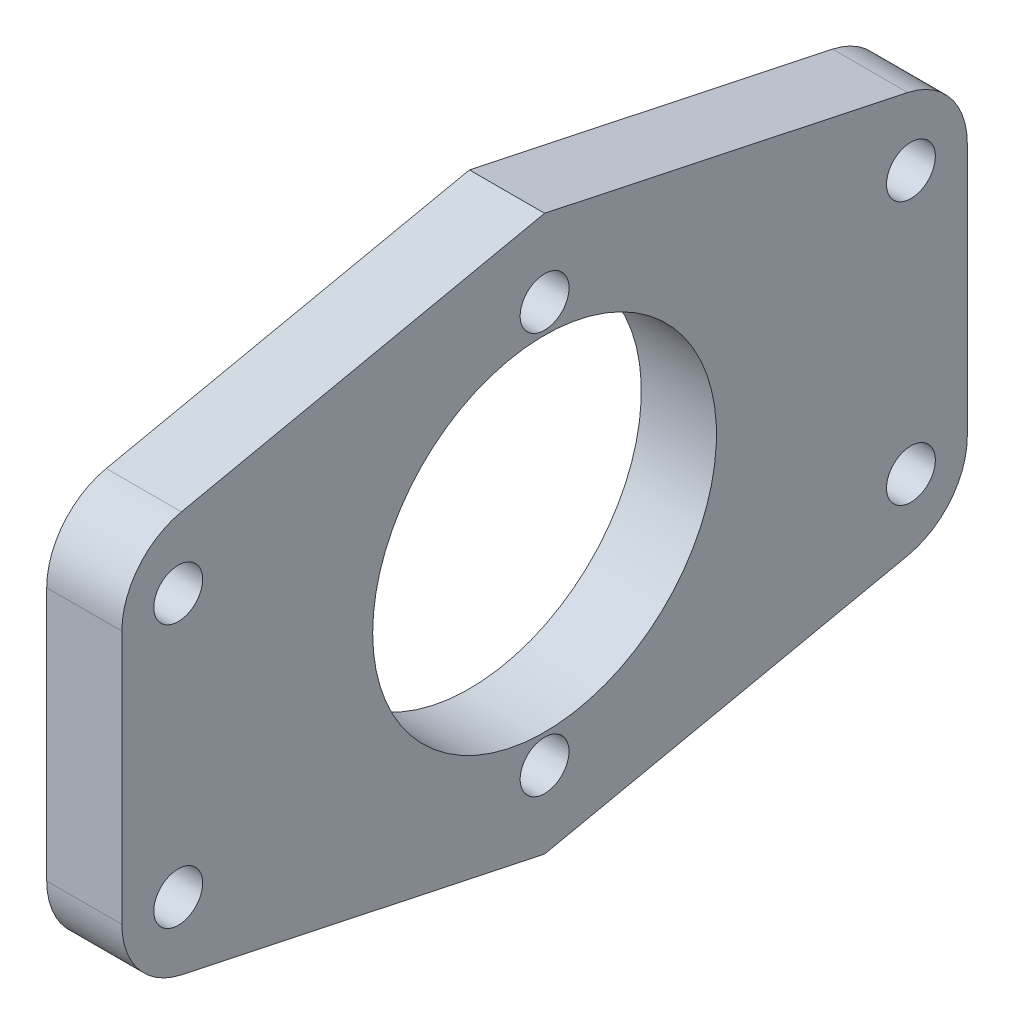
ISO-10303-21;
HEADER;
FILE_DESCRIPTION(('STEP AP214'),'2;1');
FILE_NAME('part.step','',(''),(''),'','','');
FILE_SCHEMA(('AUTOMOTIVE_DESIGN { 1 0 10303 214 1 1 1 1 }'));
ENDSEC;
DATA;
#1=APPLICATION_CONTEXT('core data for automotive mechanical design processes');
#2=APPLICATION_PROTOCOL_DEFINITION('international standard','automotive_design',2000,#1);
#3=PRODUCT_CONTEXT('',#1,'mechanical');
#4=PRODUCT('Part','Part','',(#3));
#5=PRODUCT_RELATED_PRODUCT_CATEGORY('part','',(#4));
#6=PRODUCT_DEFINITION_FORMATION('','',#4);
#7=PRODUCT_DEFINITION_CONTEXT('part definition',#1,'design');
#8=PRODUCT_DEFINITION('design','',#6,#7);
#9=PRODUCT_DEFINITION_SHAPE('','',#8);
#10=(LENGTH_UNIT() NAMED_UNIT(*) SI_UNIT(.MILLI.,.METRE.));
#11=(NAMED_UNIT(*) PLANE_ANGLE_UNIT() SI_UNIT($,.RADIAN.));
#12=(NAMED_UNIT(*) SI_UNIT($,.STERADIAN.) SOLID_ANGLE_UNIT());
#13=UNCERTAINTY_MEASURE_WITH_UNIT(LENGTH_MEASURE(1.E-05),#10,'distance_accuracy_value','');
#14=(GEOMETRIC_REPRESENTATION_CONTEXT(3) GLOBAL_UNCERTAINTY_ASSIGNED_CONTEXT((#13)) GLOBAL_UNIT_ASSIGNED_CONTEXT((#10,
#11,#12)) REPRESENTATION_CONTEXT('',''));
#15=CARTESIAN_POINT('',(0.,0.,0.));
#16=DIRECTION('',(0.,0.,1.));
#17=DIRECTION('',(1.,0.,0.));
#18=AXIS2_PLACEMENT_3D('',#15,#16,#17);
#19=CARTESIAN_POINT('',(4.,-28.2690306373786,-5.99265255801159));
#20=DIRECTION('',(0.,0.978260869565218,0.207378087264554));
#21=DIRECTION('',(0.,-0.207378087264554,0.978260869565218));
#22=AXIS2_PLACEMENT_3D('',#19,#20,#21);
#23=PLANE('',#22);
#24=DIRECTION('',(0.,0.207378087264554,-0.978260869565218));
#25=VECTOR('',#24,1.);
#26=CARTESIAN_POINT('',(0.,-28.2690306373786,-5.99265255801159));
#27=LINE('',#26,#25);
#28=CARTESIAN_POINT('',(0.,-24.7696960070847,-22.5));
#29=VERTEX_POINT('',#28);
#30=CARTESIAN_POINT('',(0.,-20.672100546187,-41.8295123490582));
#31=VERTEX_POINT('',#30);
#32=EDGE_CURVE('E162',#29,#31,#27,.T.);
#33=ORIENTED_EDGE('',*,*,#32,.T.);
#34=DIRECTION('',(-1.,0.,0.));
#35=VECTOR('',#34,1.);
#36=CARTESIAN_POINT('',(4.,-20.672100546187,-41.8295123490582));
#37=LINE('',#36,#35);
#38=CARTESIAN_POINT('',(4.,-20.672100546187,-41.8295123490582));
#39=VERTEX_POINT('',#38);
#40=EDGE_CURVE('E43',#31,#39,#37,.F.);
#41=ORIENTED_EDGE('',*,*,#40,.T.);
#42=DIRECTION('',(0.,0.207378087264554,-0.978260869565218));
#43=VECTOR('',#42,1.);
#44=CARTESIAN_POINT('',(4.,-28.2690306373786,-5.99265255801159));
#45=LINE('',#44,#43);
#46=CARTESIAN_POINT('',(4.,-24.7696960070847,-22.5));
#47=VERTEX_POINT('',#46);
#48=EDGE_CURVE('E195',#47,#39,#45,.T.);
#49=ORIENTED_EDGE('',*,*,#48,.F.);
#50=DIRECTION('',(-1.,0.,0.));
#51=VECTOR('',#50,1.);
#52=CARTESIAN_POINT('',(4.,-24.7696960070847,-22.5));
#53=LINE('',#52,#51);
#54=EDGE_CURVE('E132',#47,#29,#53,.T.);
#55=ORIENTED_EDGE('',*,*,#54,.T.);
#56=EDGE_LOOP('',(#33,#41,#49,#55));
#57=FACE_BOUND('',#56,.T.);
#58=ADVANCED_FACE('F35',(#57),#23,.F.);
#59=CARTESIAN_POINT('',(4.,0.,-45.));
#60=DIRECTION('',(0.,0.,-1.));
#61=DIRECTION('',(-1.,0.,0.));
#62=AXIS2_PLACEMENT_3D('',#59,#60,#61);
#63=PLANE('',#62);
#64=DIRECTION('',(0.,-1.,0.));
#65=VECTOR('',#64,1.);
#66=CARTESIAN_POINT('',(0.,0.,-45.));
#67=LINE('',#66,#65);
#68=CARTESIAN_POINT('',(0.,-3.24094293207383,-45.));
#69=VERTEX_POINT('',#68);
#70=CARTESIAN_POINT('',(0.,-16.7590570679262,-45.));
#71=VERTEX_POINT('',#70);
#72=EDGE_CURVE('E165',#69,#71,#67,.T.);
#73=ORIENTED_EDGE('',*,*,#72,.F.);
#74=DIRECTION('',(-1.,0.,0.));
#75=VECTOR('',#74,1.);
#76=CARTESIAN_POINT('',(4.,-3.24094293207383,-45.));
#77=LINE('',#76,#75);
#78=CARTESIAN_POINT('',(4.,-3.24094293207383,-45.));
#79=VERTEX_POINT('',#78);
#80=EDGE_CURVE('E222',#69,#79,#77,.F.);
#81=ORIENTED_EDGE('',*,*,#80,.T.);
#82=DIRECTION('',(0.,-1.,0.));
#83=VECTOR('',#82,1.);
#84=CARTESIAN_POINT('',(4.,0.,-45.));
#85=LINE('',#84,#83);
#86=CARTESIAN_POINT('',(4.,-16.7590570679262,-45.));
#87=VERTEX_POINT('',#86);
#88=EDGE_CURVE('E121',#79,#87,#85,.T.);
#89=ORIENTED_EDGE('',*,*,#88,.T.);
#90=DIRECTION('',(-1.,0.,0.));
#91=VECTOR('',#90,1.);
#92=CARTESIAN_POINT('',(0.,-16.7590570679262,-45.));
#93=LINE('',#92,#91);
#94=EDGE_CURVE('E219',#87,#71,#93,.T.);
#95=ORIENTED_EDGE('',*,*,#94,.T.);
#96=EDGE_LOOP('',(#73,#81,#89,#95));
#97=FACE_BOUND('',#96,.T.);
#98=ADVANCED_FACE('F237',(#97),#63,.T.);
#99=CARTESIAN_POINT('',(4.,9.12914405892871,-1.93525519848772));
#100=DIRECTION('',(0.,-0.978260869565218,0.207378087264554));
#101=DIRECTION('',(0.,-0.207378087264554,-0.978260869565218));
#102=AXIS2_PLACEMENT_3D('',#99,#100,#101);
#103=PLANE('',#102);
#104=DIRECTION('',(0.,0.207378087264554,0.978260869565218));
#105=VECTOR('',#104,1.);
#106=CARTESIAN_POINT('',(4.,9.12914405892871,-1.93525519848772));
#107=LINE('',#106,#105);
#108=CARTESIAN_POINT('',(4.,0.672100546187042,-41.8295123490582));
#109=VERTEX_POINT('',#108);
#110=CARTESIAN_POINT('',(4.,4.76969600708473,-22.5));
#111=VERTEX_POINT('',#110);
#112=EDGE_CURVE('E111',#109,#111,#107,.T.);
#113=ORIENTED_EDGE('',*,*,#112,.F.);
#114=DIRECTION('',(-1.,0.,0.));
#115=VECTOR('',#114,1.);
#116=CARTESIAN_POINT('',(0.,0.672100546187045,-41.8295123490582));
#117=LINE('',#116,#115);
#118=CARTESIAN_POINT('',(0.,0.672100546187042,-41.8295123490582));
#119=VERTEX_POINT('',#118);
#120=EDGE_CURVE('E217',#109,#119,#117,.T.);
#121=ORIENTED_EDGE('',*,*,#120,.T.);
#122=DIRECTION('',(0.,0.207378087264554,0.978260869565218));
#123=VECTOR('',#122,1.);
#124=CARTESIAN_POINT('',(0.,9.12914405892871,-1.93525519848772));
#125=LINE('',#124,#123);
#126=CARTESIAN_POINT('',(0.,4.76969600708473,-22.5));
#127=VERTEX_POINT('',#126);
#128=EDGE_CURVE('E127',#119,#127,#125,.T.);
#129=ORIENTED_EDGE('',*,*,#128,.T.);
#130=DIRECTION('',(-1.,0.,0.));
#131=VECTOR('',#130,1.);
#132=CARTESIAN_POINT('',(4.,4.76969600708473,-22.5));
#133=LINE('',#132,#131);
#134=EDGE_CURVE('E124',#111,#127,#133,.T.);
#135=ORIENTED_EDGE('',*,*,#134,.F.);
#136=EDGE_LOOP('',(#113,#121,#129,#135));
#137=FACE_BOUND('',#136,.T.);
#138=ADVANCED_FACE('F125',(#137),#103,.F.);
#139=CARTESIAN_POINT('',(4.,0.,0.));
#140=DIRECTION('',(0.,-0.978260869565218,-0.207378087264554));
#141=DIRECTION('',(0.,0.207378087264554,-0.978260869565218));
#142=AXIS2_PLACEMENT_3D('',#139,#140,#141);
#143=PLANE('',#142);
#144=DIRECTION('',(0.,-0.207378087264554,0.978260869565218));
#145=VECTOR('',#144,1.);
#146=CARTESIAN_POINT('',(0.,0.,0.));
#147=LINE('',#146,#145);
#148=CARTESIAN_POINT('',(0.,0.672100546187044,-3.17048765094179));
#149=VERTEX_POINT('',#148);
#150=EDGE_CURVE('E170',#127,#149,#147,.T.);
#151=ORIENTED_EDGE('',*,*,#150,.T.);
#152=DIRECTION('',(-1.,0.,0.));
#153=VECTOR('',#152,1.);
#154=CARTESIAN_POINT('',(4.,0.672100546187044,-3.17048765094179));
#155=LINE('',#154,#153);
#156=CARTESIAN_POINT('',(4.,0.672100546187044,-3.17048765094179));
#157=VERTEX_POINT('',#156);
#158=EDGE_CURVE('E136',#149,#157,#155,.F.);
#159=ORIENTED_EDGE('',*,*,#158,.T.);
#160=DIRECTION('',(0.,-0.207378087264554,0.978260869565218));
#161=VECTOR('',#160,1.);
#162=CARTESIAN_POINT('',(4.,0.,0.));
#163=LINE('',#162,#161);
#164=EDGE_CURVE('E116',#111,#157,#163,.T.);
#165=ORIENTED_EDGE('',*,*,#164,.F.);
#166=ORIENTED_EDGE('',*,*,#134,.T.);
#167=EDGE_LOOP('',(#151,#159,#165,#166));
#168=FACE_BOUND('',#167,.T.);
#169=ADVANCED_FACE('F134',(#168),#143,.F.);
#170=CARTESIAN_POINT('',(4.,0.,0.));
#171=DIRECTION('',(0.,0.,-1.));
#172=DIRECTION('',(0.,1.,0.));
#173=AXIS2_PLACEMENT_3D('',#170,#171,#172);
#174=PLANE('',#173);
#175=DIRECTION('',(0.,-1.,0.));
#176=VECTOR('',#175,1.);
#177=CARTESIAN_POINT('',(4.,0.,0.));
#178=LINE('',#177,#176);
#179=CARTESIAN_POINT('',(4.,-3.24094293207383,0.));
#180=VERTEX_POINT('',#179);
#181=CARTESIAN_POINT('',(4.,-16.7590570679262,0.));
#182=VERTEX_POINT('',#181);
#183=EDGE_CURVE('E137',#180,#182,#178,.T.);
#184=ORIENTED_EDGE('',*,*,#183,.F.);
#185=DIRECTION('',(-1.,0.,0.));
#186=VECTOR('',#185,1.);
#187=CARTESIAN_POINT('',(4.,-3.24094293207383,0.));
#188=LINE('',#187,#186);
#189=CARTESIAN_POINT('',(0.,-3.24094293207383,0.));
#190=VERTEX_POINT('',#189);
#191=EDGE_CURVE('E199',#180,#190,#188,.T.);
#192=ORIENTED_EDGE('',*,*,#191,.T.);
#193=DIRECTION('',(0.,-1.,0.));
#194=VECTOR('',#193,1.);
#195=CARTESIAN_POINT('',(0.,0.,0.));
#196=LINE('',#195,#194);
#197=CARTESIAN_POINT('',(0.,-16.7590570679262,0.));
#198=VERTEX_POINT('',#197);
#199=EDGE_CURVE('E172',#190,#198,#196,.T.);
#200=ORIENTED_EDGE('',*,*,#199,.T.);
#201=DIRECTION('',(-1.,0.,0.));
#202=VECTOR('',#201,1.);
#203=CARTESIAN_POINT('',(4.,-16.7590570679262,0.));
#204=LINE('',#203,#202);
#205=EDGE_CURVE('E131',#198,#182,#204,.F.);
#206=ORIENTED_EDGE('',*,*,#205,.T.);
#207=EDGE_LOOP('',(#184,#192,#200,#206));
#208=FACE_BOUND('',#207,.T.);
#209=ADVANCED_FACE('F296',(#208),#174,.F.);
#210=CARTESIAN_POINT('',(4.,-3.,-42.));
#211=DIRECTION('',(-1.,0.,0.));
#212=DIRECTION('',(0.,0.,1.));
#213=AXIS2_PLACEMENT_3D('',#210,#211,#212);
#214=CYLINDRICAL_SURFACE('',#213,1.3);
#215=CARTESIAN_POINT('',(4.,-3.,-42.));
#216=DIRECTION('',(1.,0.,0.));
#217=DIRECTION('',(0.,0.,-1.));
#218=AXIS2_PLACEMENT_3D('',#215,#216,#217);
#219=CIRCLE('',#218,1.3);
#220=CARTESIAN_POINT('',(4.,-3.,-43.3));
#221=VERTEX_POINT('',#220);
#222=EDGE_CURVE('E156',#221,#221,#219,.T.);
#223=ORIENTED_EDGE('',*,*,#222,.T.);
#224=EDGE_LOOP('',(#223));
#225=FACE_BOUND('',#224,.T.);
#226=CARTESIAN_POINT('',(0.,-3.,-42.));
#227=DIRECTION('',(1.,0.,0.));
#228=DIRECTION('',(0.,0.,-1.));
#229=AXIS2_PLACEMENT_3D('',#226,#227,#228);
#230=CIRCLE('',#229,1.3);
#231=CARTESIAN_POINT('',(0.,-3.,-43.3));
#232=VERTEX_POINT('',#231);
#233=EDGE_CURVE('E189',#232,#232,#230,.T.);
#234=ORIENTED_EDGE('',*,*,#233,.F.);
#235=EDGE_LOOP('',(#234));
#236=FACE_BOUND('',#235,.T.);
#237=ADVANCED_FACE('F299',(#225,#236),#214,.F.);
#238=CARTESIAN_POINT('',(4.,-3.00000000000081,-3.));
#239=DIRECTION('',(-1.,0.,0.));
#240=DIRECTION('',(0.,0.,1.));
#241=AXIS2_PLACEMENT_3D('',#238,#239,#240);
#242=CYLINDRICAL_SURFACE('',#241,1.3);
#243=CARTESIAN_POINT('',(4.,-3.00000000000081,-3.));
#244=DIRECTION('',(1.,0.,0.));
#245=DIRECTION('',(0.,0.,-1.));
#246=AXIS2_PLACEMENT_3D('',#243,#244,#245);
#247=CIRCLE('',#246,1.3);
#248=CARTESIAN_POINT('',(4.,-3.00000000000081,-4.3));
#249=VERTEX_POINT('',#248);
#250=EDGE_CURVE('E153',#249,#249,#247,.T.);
#251=ORIENTED_EDGE('',*,*,#250,.T.);
#252=EDGE_LOOP('',(#251));
#253=FACE_BOUND('',#252,.T.);
#254=CARTESIAN_POINT('',(0.,-3.00000000000081,-3.));
#255=DIRECTION('',(1.,0.,0.));
#256=DIRECTION('',(0.,0.,-1.));
#257=AXIS2_PLACEMENT_3D('',#254,#255,#256);
#258=CIRCLE('',#257,1.3);
#259=CARTESIAN_POINT('',(0.,-3.00000000000081,-4.3));
#260=VERTEX_POINT('',#259);
#261=EDGE_CURVE('E186',#260,#260,#258,.T.);
#262=ORIENTED_EDGE('',*,*,#261,.F.);
#263=EDGE_LOOP('',(#262));
#264=FACE_BOUND('',#263,.T.);
#265=ADVANCED_FACE('F306',(#253,#264),#242,.F.);
#266=CARTESIAN_POINT('',(4.,-17.0000000000008,-3.00000000000034));
#267=DIRECTION('',(-1.,0.,0.));
#268=DIRECTION('',(0.,0.,1.));
#269=AXIS2_PLACEMENT_3D('',#266,#267,#268);
#270=CYLINDRICAL_SURFACE('',#269,1.3);
#271=CARTESIAN_POINT('',(4.,-17.0000000000008,-3.00000000000034));
#272=DIRECTION('',(1.,0.,0.));
#273=DIRECTION('',(0.,0.,-1.));
#274=AXIS2_PLACEMENT_3D('',#271,#272,#273);
#275=CIRCLE('',#274,1.3);
#276=CARTESIAN_POINT('',(4.,-17.0000000000008,-4.30000000000034));
#277=VERTEX_POINT('',#276);
#278=EDGE_CURVE('E150',#277,#277,#275,.T.);
#279=ORIENTED_EDGE('',*,*,#278,.T.);
#280=EDGE_LOOP('',(#279));
#281=FACE_BOUND('',#280,.T.);
#282=CARTESIAN_POINT('',(0.,-17.0000000000008,-3.00000000000034));
#283=DIRECTION('',(1.,0.,0.));
#284=DIRECTION('',(0.,0.,-1.));
#285=AXIS2_PLACEMENT_3D('',#282,#283,#284);
#286=CIRCLE('',#285,1.3);
#287=CARTESIAN_POINT('',(0.,-17.0000000000008,-4.30000000000034));
#288=VERTEX_POINT('',#287);
#289=EDGE_CURVE('E183',#288,#288,#286,.T.);
#290=ORIENTED_EDGE('',*,*,#289,.F.);
#291=EDGE_LOOP('',(#290));
#292=FACE_BOUND('',#291,.T.);
#293=ADVANCED_FACE('F337',(#281,#292),#270,.F.);
#294=CARTESIAN_POINT('',(4.,-17.,-42.0000000000001));
#295=DIRECTION('',(-1.,0.,0.));
#296=DIRECTION('',(0.,0.,1.));
#297=AXIS2_PLACEMENT_3D('',#294,#295,#296);
#298=CYLINDRICAL_SURFACE('',#297,1.3);
#299=CARTESIAN_POINT('',(4.,-17.,-42.0000000000001));
#300=DIRECTION('',(1.,0.,0.));
#301=DIRECTION('',(0.,0.,-1.));
#302=AXIS2_PLACEMENT_3D('',#299,#300,#301);
#303=CIRCLE('',#302,1.3);
#304=CARTESIAN_POINT('',(4.,-17.,-43.3000000000001));
#305=VERTEX_POINT('',#304);
#306=EDGE_CURVE('E147',#305,#305,#303,.T.);
#307=ORIENTED_EDGE('',*,*,#306,.T.);
#308=EDGE_LOOP('',(#307));
#309=FACE_BOUND('',#308,.T.);
#310=CARTESIAN_POINT('',(0.,-17.,-42.0000000000001));
#311=DIRECTION('',(1.,0.,0.));
#312=DIRECTION('',(0.,0.,-1.));
#313=AXIS2_PLACEMENT_3D('',#310,#311,#312);
#314=CIRCLE('',#313,1.3);
#315=CARTESIAN_POINT('',(0.,-17.,-43.3000000000001));
#316=VERTEX_POINT('',#315);
#317=EDGE_CURVE('E180',#316,#316,#314,.T.);
#318=ORIENTED_EDGE('',*,*,#317,.F.);
#319=EDGE_LOOP('',(#318));
#320=FACE_BOUND('',#319,.T.);
#321=ADVANCED_FACE('F345',(#309,#320),#298,.F.);
#322=CARTESIAN_POINT('',(4.,-20.6808071181958,-22.5));
#323=DIRECTION('',(-1.,0.,0.));
#324=DIRECTION('',(0.,0.,1.));
#325=AXIS2_PLACEMENT_3D('',#322,#323,#324);
#326=CYLINDRICAL_SURFACE('',#325,1.3);
#327=CARTESIAN_POINT('',(4.,-20.6808071181958,-22.5));
#328=DIRECTION('',(1.,0.,0.));
#329=DIRECTION('',(0.,0.,-1.));
#330=AXIS2_PLACEMENT_3D('',#327,#328,#329);
#331=CIRCLE('',#330,1.3);
#332=CARTESIAN_POINT('',(4.,-20.6808071181958,-23.8));
#333=VERTEX_POINT('',#332);
#334=EDGE_CURVE('E144',#333,#333,#331,.T.);
#335=ORIENTED_EDGE('',*,*,#334,.T.);
#336=EDGE_LOOP('',(#335));
#337=FACE_BOUND('',#336,.T.);
#338=CARTESIAN_POINT('',(0.,-20.6808071181958,-22.5));
#339=DIRECTION('',(1.,0.,0.));
#340=DIRECTION('',(0.,0.,-1.));
#341=AXIS2_PLACEMENT_3D('',#338,#339,#340);
#342=CIRCLE('',#341,1.3);
#343=CARTESIAN_POINT('',(0.,-20.6808071181958,-23.8));
#344=VERTEX_POINT('',#343);
#345=EDGE_CURVE('E177',#344,#344,#342,.T.);
#346=ORIENTED_EDGE('',*,*,#345,.F.);
#347=EDGE_LOOP('',(#346));
#348=FACE_BOUND('',#347,.T.);
#349=ADVANCED_FACE('F353',(#337,#348),#326,.F.);
#350=CARTESIAN_POINT('',(4.,-19.1398865784499,4.05739735952387));
#351=DIRECTION('',(0.,0.978260869565218,-0.207378087264554));
#352=DIRECTION('',(0.,0.207378087264554,0.978260869565218));
#353=AXIS2_PLACEMENT_3D('',#350,#351,#352);
#354=PLANE('',#353);
#355=DIRECTION('',(0.,-0.207378087264554,-0.978260869565218));
#356=VECTOR('',#355,1.);
#357=CARTESIAN_POINT('',(4.,-19.1398865784499,4.05739735952387));
#358=LINE('',#357,#356);
#359=CARTESIAN_POINT('',(4.,-20.672100546187,-3.17048765094179));
#360=VERTEX_POINT('',#359);
#361=EDGE_CURVE('E139',#360,#47,#358,.T.);
#362=ORIENTED_EDGE('',*,*,#361,.F.);
#363=DIRECTION('',(-1.,0.,0.));
#364=VECTOR('',#363,1.);
#365=CARTESIAN_POINT('',(4.,-20.672100546187,-3.17048765094179));
#366=LINE('',#365,#364);
#367=CARTESIAN_POINT('',(0.,-20.672100546187,-3.17048765094179));
#368=VERTEX_POINT('',#367);
#369=EDGE_CURVE('E11',#360,#368,#366,.T.);
#370=ORIENTED_EDGE('',*,*,#369,.T.);
#371=DIRECTION('',(0.,-0.207378087264554,-0.978260869565218));
#372=VECTOR('',#371,1.);
#373=CARTESIAN_POINT('',(0.,-19.1398865784499,4.05739735952387));
#374=LINE('',#373,#372);
#375=EDGE_CURVE('E175',#368,#29,#374,.T.);
#376=ORIENTED_EDGE('',*,*,#375,.T.);
#377=ORIENTED_EDGE('',*,*,#54,.F.);
#378=EDGE_LOOP('',(#362,#370,#376,#377));
#379=FACE_BOUND('',#378,.T.);
#380=ADVANCED_FACE('F293',(#379),#354,.F.);
#381=CARTESIAN_POINT('',(4.,0.680807118195842,-22.5));
#382=DIRECTION('',(-1.,0.,0.));
#383=DIRECTION('',(0.,0.,1.));
#384=AXIS2_PLACEMENT_3D('',#381,#382,#383);
#385=CYLINDRICAL_SURFACE('',#384,1.3);
#386=CARTESIAN_POINT('',(4.,0.680807118195842,-22.5));
#387=DIRECTION('',(1.,0.,0.));
#388=DIRECTION('',(0.,0.,-1.));
#389=AXIS2_PLACEMENT_3D('',#386,#387,#388);
#390=CIRCLE('',#389,1.3);
#391=CARTESIAN_POINT('',(4.,0.680807118195842,-23.8));
#392=VERTEX_POINT('',#391);
#393=EDGE_CURVE('E159',#392,#392,#390,.T.);
#394=ORIENTED_EDGE('',*,*,#393,.T.);
#395=EDGE_LOOP('',(#394));
#396=FACE_BOUND('',#395,.T.);
#397=CARTESIAN_POINT('',(0.,0.680807118195842,-22.5));
#398=DIRECTION('',(1.,0.,0.));
#399=DIRECTION('',(0.,0.,-1.));
#400=AXIS2_PLACEMENT_3D('',#397,#398,#399);
#401=CIRCLE('',#400,1.3);
#402=CARTESIAN_POINT('',(0.,0.680807118195842,-23.8));
#403=VERTEX_POINT('',#402);
#404=EDGE_CURVE('E192',#403,#403,#401,.T.);
#405=ORIENTED_EDGE('',*,*,#404,.F.);
#406=EDGE_LOOP('',(#405));
#407=FACE_BOUND('',#406,.T.);
#408=ADVANCED_FACE('F266',(#396,#407),#385,.F.);
#409=CARTESIAN_POINT('',(4.,0.,0.));
#410=DIRECTION('',(1.,0.,0.));
#411=DIRECTION('',(0.,0.,-1.));
#412=AXIS2_PLACEMENT_3D('',#409,#410,#411);
#413=PLANE('',#412);
#414=CARTESIAN_POINT('',(4.,-10.,-22.5));
#415=DIRECTION('',(-1.,0.,0.));
#416=DIRECTION('',(0.,0.,1.));
#417=AXIS2_PLACEMENT_3D('',#414,#415,#416);
#418=CIRCLE('',#417,9.15);
#419=CARTESIAN_POINT('',(4.,-10.,-13.35));
#420=VERTEX_POINT('',#419);
#421=EDGE_CURVE('E166',#420,#420,#418,.T.);
#422=ORIENTED_EDGE('',*,*,#421,.T.);
#423=EDGE_LOOP('',(#422));
#424=FACE_BOUND('',#423,.T.);
#425=ORIENTED_EDGE('',*,*,#164,.T.);
#426=CARTESIAN_POINT('',(4.,-3.24094293207383,-4.));
#427=DIRECTION('',(1.,0.,0.));
#428=DIRECTION('',(0.,0.,-1.));
#429=AXIS2_PLACEMENT_3D('',#426,#427,#428);
#430=CIRCLE('',#429,4.);
#431=EDGE_CURVE('E215',#157,#180,#430,.T.);
#432=ORIENTED_EDGE('',*,*,#431,.T.);
#433=ORIENTED_EDGE('',*,*,#183,.T.);
#434=CARTESIAN_POINT('',(4.,-16.7590570679262,-4.));
#435=DIRECTION('',(1.,0.,0.));
#436=DIRECTION('',(0.,0.,-1.));
#437=AXIS2_PLACEMENT_3D('',#434,#435,#436);
#438=CIRCLE('',#437,4.);
#439=EDGE_CURVE('E50',#182,#360,#438,.T.);
#440=ORIENTED_EDGE('',*,*,#439,.T.);
#441=ORIENTED_EDGE('',*,*,#361,.T.);
#442=ORIENTED_EDGE('',*,*,#48,.T.);
#443=CARTESIAN_POINT('',(4.,-16.7590570679262,-41.));
#444=DIRECTION('',(1.,0.,0.));
#445=DIRECTION('',(0.,0.,-1.));
#446=AXIS2_PLACEMENT_3D('',#443,#444,#445);
#447=CIRCLE('',#446,4.);
#448=EDGE_CURVE('E212',#39,#87,#447,.T.);
#449=ORIENTED_EDGE('',*,*,#448,.T.);
#450=ORIENTED_EDGE('',*,*,#88,.F.);
#451=CARTESIAN_POINT('',(4.,-3.24094293207383,-41.));
#452=DIRECTION('',(1.,0.,0.));
#453=DIRECTION('',(0.,0.,-1.));
#454=AXIS2_PLACEMENT_3D('',#451,#452,#453);
#455=CIRCLE('',#454,4.);
#456=EDGE_CURVE('E57',#79,#109,#455,.T.);
#457=ORIENTED_EDGE('',*,*,#456,.T.);
#458=ORIENTED_EDGE('',*,*,#112,.T.);
#459=EDGE_LOOP('',(#425,#432,#433,#440,#441,#442,#449,#450,#457,#458));
#460=FACE_BOUND('',#459,.T.);
#461=ORIENTED_EDGE('',*,*,#334,.F.);
#462=EDGE_LOOP('',(#461));
#463=FACE_BOUND('',#462,.T.);
#464=ORIENTED_EDGE('',*,*,#306,.F.);
#465=EDGE_LOOP('',(#464));
#466=FACE_BOUND('',#465,.T.);
#467=ORIENTED_EDGE('',*,*,#278,.F.);
#468=EDGE_LOOP('',(#467));
#469=FACE_BOUND('',#468,.T.);
#470=ORIENTED_EDGE('',*,*,#250,.F.);
#471=EDGE_LOOP('',(#470));
#472=FACE_BOUND('',#471,.T.);
#473=ORIENTED_EDGE('',*,*,#222,.F.);
#474=EDGE_LOOP('',(#473));
#475=FACE_BOUND('',#474,.T.);
#476=ORIENTED_EDGE('',*,*,#393,.F.);
#477=EDGE_LOOP('',(#476));
#478=FACE_BOUND('',#477,.T.);
#479=ADVANCED_FACE('F113',(#424,#460,#463,#466,#469,#472,#475,#478),#413,.T.);
#480=CARTESIAN_POINT('',(0.,0.,0.));
#481=DIRECTION('',(1.,0.,0.));
#482=DIRECTION('',(0.,0.,-1.));
#483=AXIS2_PLACEMENT_3D('',#480,#481,#482);
#484=PLANE('',#483);
#485=CARTESIAN_POINT('',(0.,-10.,-22.5));
#486=DIRECTION('',(-1.,0.,0.));
#487=DIRECTION('',(0.,0.,1.));
#488=AXIS2_PLACEMENT_3D('',#485,#486,#487);
#489=CIRCLE('',#488,9.15);
#490=CARTESIAN_POINT('',(0.,-10.,-13.35));
#491=VERTEX_POINT('',#490);
#492=EDGE_CURVE('E246',#491,#491,#489,.T.);
#493=ORIENTED_EDGE('',*,*,#492,.F.);
#494=EDGE_LOOP('',(#493));
#495=FACE_BOUND('',#494,.T.);
#496=ORIENTED_EDGE('',*,*,#199,.F.);
#497=CARTESIAN_POINT('',(0.,-3.24094293207383,-4.));
#498=DIRECTION('',(1.,0.,0.));
#499=DIRECTION('',(0.,0.,-1.));
#500=AXIS2_PLACEMENT_3D('',#497,#498,#499);
#501=CIRCLE('',#500,4.);
#502=EDGE_CURVE('E208',#190,#149,#501,.F.);
#503=ORIENTED_EDGE('',*,*,#502,.T.);
#504=ORIENTED_EDGE('',*,*,#150,.F.);
#505=ORIENTED_EDGE('',*,*,#128,.F.);
#506=CARTESIAN_POINT('',(0.,-3.24094293207383,-41.));
#507=DIRECTION('',(1.,0.,0.));
#508=DIRECTION('',(0.,0.,-1.));
#509=AXIS2_PLACEMENT_3D('',#506,#507,#508);
#510=CIRCLE('',#509,4.);
#511=EDGE_CURVE('E206',#119,#69,#510,.F.);
#512=ORIENTED_EDGE('',*,*,#511,.T.);
#513=ORIENTED_EDGE('',*,*,#72,.T.);
#514=CARTESIAN_POINT('',(0.,-16.7590570679262,-41.));
#515=DIRECTION('',(1.,0.,0.));
#516=DIRECTION('',(0.,0.,-1.));
#517=AXIS2_PLACEMENT_3D('',#514,#515,#516);
#518=CIRCLE('',#517,4.);
#519=EDGE_CURVE('E204',#71,#31,#518,.F.);
#520=ORIENTED_EDGE('',*,*,#519,.T.);
#521=ORIENTED_EDGE('',*,*,#32,.F.);
#522=ORIENTED_EDGE('',*,*,#375,.F.);
#523=CARTESIAN_POINT('',(0.,-16.7590570679262,-4.));
#524=DIRECTION('',(1.,0.,0.));
#525=DIRECTION('',(0.,0.,-1.));
#526=AXIS2_PLACEMENT_3D('',#523,#524,#525);
#527=CIRCLE('',#526,4.);
#528=EDGE_CURVE('E202',#368,#198,#527,.F.);
#529=ORIENTED_EDGE('',*,*,#528,.T.);
#530=EDGE_LOOP('',(#496,#503,#504,#505,#512,#513,#520,#521,#522,#529));
#531=FACE_BOUND('',#530,.T.);
#532=ORIENTED_EDGE('',*,*,#345,.T.);
#533=EDGE_LOOP('',(#532));
#534=FACE_BOUND('',#533,.T.);
#535=ORIENTED_EDGE('',*,*,#317,.T.);
#536=EDGE_LOOP('',(#535));
#537=FACE_BOUND('',#536,.T.);
#538=ORIENTED_EDGE('',*,*,#289,.T.);
#539=EDGE_LOOP('',(#538));
#540=FACE_BOUND('',#539,.T.);
#541=ORIENTED_EDGE('',*,*,#261,.T.);
#542=EDGE_LOOP('',(#541));
#543=FACE_BOUND('',#542,.T.);
#544=ORIENTED_EDGE('',*,*,#233,.T.);
#545=EDGE_LOOP('',(#544));
#546=FACE_BOUND('',#545,.T.);
#547=ORIENTED_EDGE('',*,*,#404,.T.);
#548=EDGE_LOOP('',(#547));
#549=FACE_BOUND('',#548,.T.);
#550=ADVANCED_FACE('F241',(#495,#531,#534,#537,#540,#543,#546,#549),#484,.F.);
#551=CARTESIAN_POINT('',(4.,-10.,-22.5));
#552=DIRECTION('',(-1.,0.,0.));
#553=DIRECTION('',(0.,0.,1.));
#554=AXIS2_PLACEMENT_3D('',#551,#552,#553);
#555=CYLINDRICAL_SURFACE('',#554,9.15);
#556=ORIENTED_EDGE('',*,*,#421,.F.);
#557=EDGE_LOOP('',(#556));
#558=FACE_BOUND('',#557,.T.);
#559=ORIENTED_EDGE('',*,*,#492,.T.);
#560=EDGE_LOOP('',(#559));
#561=FACE_BOUND('',#560,.T.);
#562=ADVANCED_FACE('F253',(#558,#561),#555,.F.);
#563=CARTESIAN_POINT('',(4.,-3.24094293207383,-4.));
#564=DIRECTION('',(-1.,0.,0.));
#565=DIRECTION('',(0.,0.,1.));
#566=AXIS2_PLACEMENT_3D('',#563,#564,#565);
#567=CYLINDRICAL_SURFACE('',#566,4.);
#568=ORIENTED_EDGE('',*,*,#431,.F.);
#569=ORIENTED_EDGE('',*,*,#158,.F.);
#570=ORIENTED_EDGE('',*,*,#502,.F.);
#571=ORIENTED_EDGE('',*,*,#191,.F.);
#572=EDGE_LOOP('',(#568,#569,#570,#571));
#573=FACE_BOUND('',#572,.T.);
#574=ADVANCED_FACE('F256',(#573),#567,.T.);
#575=CARTESIAN_POINT('',(4.,-3.24094293207383,-41.));
#576=DIRECTION('',(1.,0.,0.));
#577=DIRECTION('',(0.,0.,-1.));
#578=AXIS2_PLACEMENT_3D('',#575,#576,#577);
#579=CYLINDRICAL_SURFACE('',#578,4.);
#580=ORIENTED_EDGE('',*,*,#456,.F.);
#581=ORIENTED_EDGE('',*,*,#80,.F.);
#582=ORIENTED_EDGE('',*,*,#511,.F.);
#583=ORIENTED_EDGE('',*,*,#120,.F.);
#584=EDGE_LOOP('',(#580,#581,#582,#583));
#585=FACE_BOUND('',#584,.T.);
#586=ADVANCED_FACE('F244',(#585),#579,.T.);
#587=CARTESIAN_POINT('',(4.,-16.7590570679262,-41.));
#588=DIRECTION('',(1.,0.,0.));
#589=DIRECTION('',(0.,0.,-1.));
#590=AXIS2_PLACEMENT_3D('',#587,#588,#589);
#591=CYLINDRICAL_SURFACE('',#590,4.);
#592=ORIENTED_EDGE('',*,*,#448,.F.);
#593=ORIENTED_EDGE('',*,*,#40,.F.);
#594=ORIENTED_EDGE('',*,*,#519,.F.);
#595=ORIENTED_EDGE('',*,*,#94,.F.);
#596=EDGE_LOOP('',(#592,#593,#594,#595));
#597=FACE_BOUND('',#596,.T.);
#598=ADVANCED_FACE('F234',(#597),#591,.T.);
#599=CARTESIAN_POINT('',(4.,-16.7590570679262,-4.));
#600=DIRECTION('',(-1.,0.,0.));
#601=DIRECTION('',(0.,0.,1.));
#602=AXIS2_PLACEMENT_3D('',#599,#600,#601);
#603=CYLINDRICAL_SURFACE('',#602,4.);
#604=ORIENTED_EDGE('',*,*,#439,.F.);
#605=ORIENTED_EDGE('',*,*,#205,.F.);
#606=ORIENTED_EDGE('',*,*,#528,.F.);
#607=ORIENTED_EDGE('',*,*,#369,.F.);
#608=EDGE_LOOP('',(#604,#605,#606,#607));
#609=FACE_BOUND('',#608,.T.);
#610=ADVANCED_FACE('F37',(#609),#603,.T.);
#611=CLOSED_SHELL('',(#58,#98,#138,#169,#209,#237,#265,#293,#321,#349,#380,#408,#479,#550,#562,
#574,#586,#598,#610));
#612=MANIFOLD_SOLID_BREP('B2',#611);
#613=ADVANCED_BREP_SHAPE_REPRESENTATION('',(#18,#612),#14);
#614=SHAPE_DEFINITION_REPRESENTATION(#9,#613);
ENDSEC;
END-ISO-10303-21;
